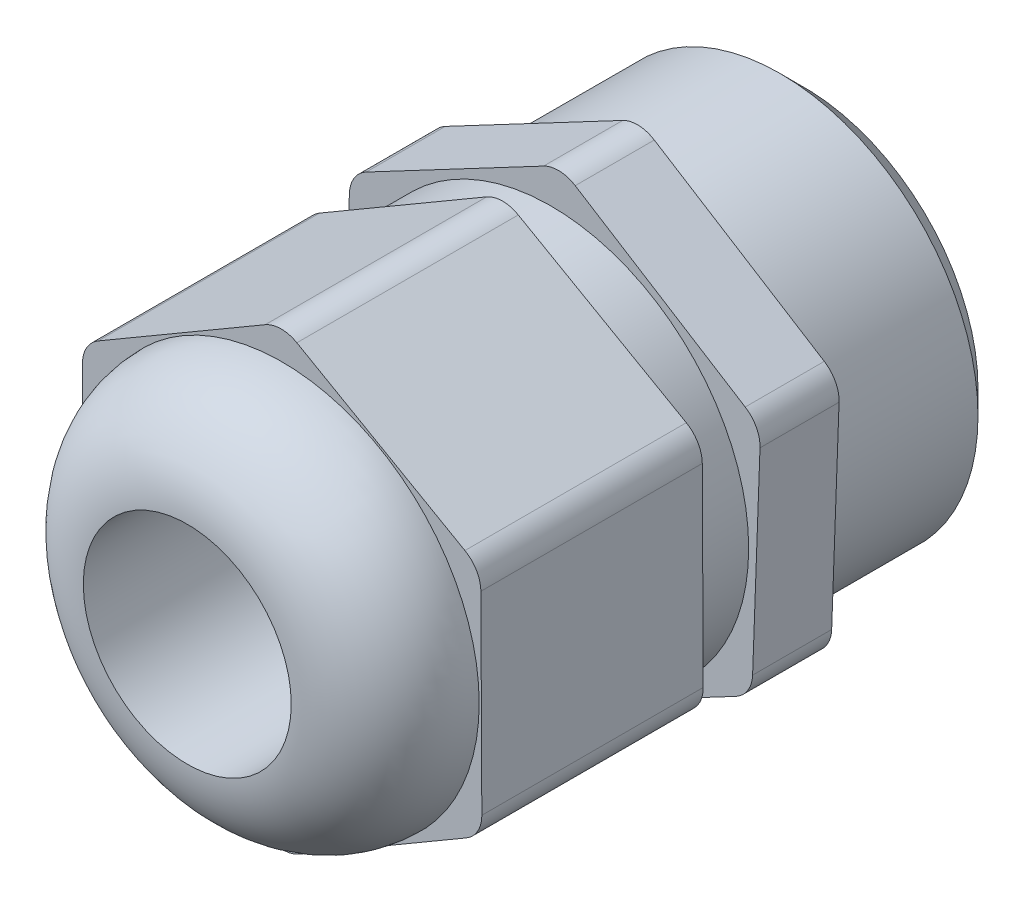
ISO-10303-21;
HEADER;
FILE_DESCRIPTION(('STEP AP214'),'2;1');
FILE_NAME('part.step','',(''),(''),'','','');
FILE_SCHEMA(('AUTOMOTIVE_DESIGN { 1 0 10303 214 1 1 1 1 }'));
ENDSEC;
DATA;
#1=APPLICATION_CONTEXT('core data for automotive mechanical design processes');
#2=APPLICATION_PROTOCOL_DEFINITION('international standard','automotive_design',2000,#1);
#3=PRODUCT_CONTEXT('',#1,'mechanical');
#4=PRODUCT('Part','Part','',(#3));
#5=PRODUCT_RELATED_PRODUCT_CATEGORY('part','',(#4));
#6=PRODUCT_DEFINITION_FORMATION('','',#4);
#7=PRODUCT_DEFINITION_CONTEXT('part definition',#1,'design');
#8=PRODUCT_DEFINITION('design','',#6,#7);
#9=PRODUCT_DEFINITION_SHAPE('','',#8);
#10=(LENGTH_UNIT() NAMED_UNIT(*) SI_UNIT(.MILLI.,.METRE.));
#11=(NAMED_UNIT(*) PLANE_ANGLE_UNIT() SI_UNIT($,.RADIAN.));
#12=(NAMED_UNIT(*) SI_UNIT($,.STERADIAN.) SOLID_ANGLE_UNIT());
#13=UNCERTAINTY_MEASURE_WITH_UNIT(LENGTH_MEASURE(1.E-05),#10,'distance_accuracy_value','');
#14=(GEOMETRIC_REPRESENTATION_CONTEXT(3) GLOBAL_UNCERTAINTY_ASSIGNED_CONTEXT((#13)) GLOBAL_UNIT_ASSIGNED_CONTEXT((#10,
#11,#12)) REPRESENTATION_CONTEXT('',''));
#15=CARTESIAN_POINT('',(0.,0.,0.));
#16=DIRECTION('',(0.,0.,1.));
#17=DIRECTION('',(1.,0.,0.));
#18=AXIS2_PLACEMENT_3D('',#15,#16,#17);
#19=CARTESIAN_POINT('',(12.5593851805348,7.33553925217825,22.));
#20=DIRECTION('',(0.,0.,1.));
#21=DIRECTION('',(1.,0.,0.));
#22=AXIS2_PLACEMENT_3D('',#19,#20,#21);
#23=PLANE('',#22);
#24=DIRECTION('',(0.00502387492270915,-0.999987380260752,0.));
#25=VECTOR('',#24,1.);
#26=CARTESIAN_POINT('',(-12.6324559331117,7.20897699616786,22.));
#27=LINE('',#26,#25);
#28=CARTESIAN_POINT('',(-12.6266548620337,6.05429102980831,22.));
#29=VERTEX_POINT('',#28);
#30=CARTESIAN_POINT('',(-12.5651862516128,-6.1808532858187,22.));
#31=VERTEX_POINT('',#30);
#32=EDGE_CURVE('E763',#29,#31,#27,.T.);
#33=ORIENTED_EDGE('',*,*,#32,.T.);
#34=CARTESIAN_POINT('',(-10.5652114910913,-6.17080553597328,22.));
#35=DIRECTION('',(0.,0.,1.));
#36=DIRECTION('',(1.,0.,0.));
#37=AXIS2_PLACEMENT_3D('',#34,#35,#36);
#38=CIRCLE('',#37,2.);
#39=CARTESIAN_POINT('',(-11.5564972647351,-7.90785836043531,22.));
#40=VERTEX_POINT('',#39);
#41=EDGE_CURVE('E313',#31,#40,#38,.T.);
#42=ORIENTED_EDGE('',*,*,#41,.T.);
#43=DIRECTION('',(0.868526412231015,-0.495642886821874,0.));
#44=VECTOR('',#43,1.);
#45=CARTESIAN_POINT('',(-12.5593851805348,-7.33553925217825,22.));
#46=LINE('',#45,#44);
#47=CARTESIAN_POINT('',(-0.929817163222912,-13.972197140089,22.));
#48=VERTEX_POINT('',#47);
#49=EDGE_CURVE('E221',#40,#48,#46,.T.);
#50=ORIENTED_EDGE('',*,*,#49,.T.);
#51=CARTESIAN_POINT('',(0.0614686104208379,-12.235144315627,22.));
#52=DIRECTION('',(0.,0.,1.));
#53=DIRECTION('',(1.,0.,0.));
#54=AXIS2_PLACEMENT_3D('',#51,#52,#53);
#55=CIRCLE('',#54,2.);
#56=CARTESIAN_POINT('',(1.07015759729859,-13.9621493902436,22.));
#57=VERTEX_POINT('',#56);
#58=EDGE_CURVE('E309',#48,#57,#55,.T.);
#59=ORIENTED_EDGE('',*,*,#58,.T.);
#60=DIRECTION('',(0.863502537308306,0.504344493438878,0.));
#61=VECTOR('',#60,1.);
#62=CARTESIAN_POINT('',(0.0730707525768426,-14.5445162483461,22.));
#63=LINE('',#62,#61);
#64=CARTESIAN_POINT('',(11.6353690883899,-7.79134385427034,22.));
#65=VERTEX_POINT('',#64);
#66=EDGE_CURVE('E246',#57,#65,#63,.T.);
#67=ORIENTED_EDGE('',*,*,#66,.T.);
#68=CARTESIAN_POINT('',(10.6266801015122,-6.06433877965373,22.));
#69=DIRECTION('',(0.,0.,1.));
#70=DIRECTION('',(1.,0.,0.));
#71=AXIS2_PLACEMENT_3D('',#68,#69,#70);
#72=CIRCLE('',#71,2.);
#73=CARTESIAN_POINT('',(12.6266548620337,-6.05429102980831,22.));
#74=VERTEX_POINT('',#73);
#75=EDGE_CURVE('E307',#65,#74,#72,.T.);
#76=ORIENTED_EDGE('',*,*,#75,.T.);
#77=DIRECTION('',(-0.00502387492270915,0.999987380260752,0.));
#78=VECTOR('',#77,1.);
#79=CARTESIAN_POINT('',(12.6324559331117,-7.20897699616786,22.));
#80=LINE('',#79,#78);
#81=CARTESIAN_POINT('',(12.5651862516128,6.1808532858187,22.));
#82=VERTEX_POINT('',#81);
#83=EDGE_CURVE('E233',#74,#82,#80,.T.);
#84=ORIENTED_EDGE('',*,*,#83,.T.);
#85=CARTESIAN_POINT('',(10.5652114910913,6.17080553597329,22.));
#86=DIRECTION('',(0.,0.,1.));
#87=DIRECTION('',(1.,0.,0.));
#88=AXIS2_PLACEMENT_3D('',#85,#86,#87);
#89=CIRCLE('',#88,2.);
#90=CARTESIAN_POINT('',(11.5564972647351,7.90785836043532,22.));
#91=VERTEX_POINT('',#90);
#92=EDGE_CURVE('E303',#82,#91,#89,.T.);
#93=ORIENTED_EDGE('',*,*,#92,.T.);
#94=DIRECTION('',(-0.868526412231015,0.495642886821874,0.));
#95=VECTOR('',#94,1.);
#96=CARTESIAN_POINT('',(12.5593851805348,7.33553925217825,22.));
#97=LINE('',#96,#95);
#98=CARTESIAN_POINT('',(0.929817163222912,13.972197140089,22.));
#99=VERTEX_POINT('',#98);
#100=EDGE_CURVE('E757',#91,#99,#97,.T.);
#101=ORIENTED_EDGE('',*,*,#100,.T.);
#102=CARTESIAN_POINT('',(-0.0614686104208394,12.235144315627,22.));
#103=DIRECTION('',(0.,0.,1.));
#104=DIRECTION('',(1.,0.,0.));
#105=AXIS2_PLACEMENT_3D('',#102,#103,#104);
#106=CIRCLE('',#105,2.);
#107=CARTESIAN_POINT('',(-1.07015759729859,13.9621493902436,22.));
#108=VERTEX_POINT('',#107);
#109=EDGE_CURVE('E305',#99,#108,#106,.T.);
#110=ORIENTED_EDGE('',*,*,#109,.T.);
#111=DIRECTION('',(-0.863502537308306,-0.504344493438877,0.));
#112=VECTOR('',#111,1.);
#113=CARTESIAN_POINT('',(-0.0730707525768443,14.5445162483461,22.));
#114=LINE('',#113,#112);
#115=CARTESIAN_POINT('',(-11.6353690883899,7.79134385427034,22.));
#116=VERTEX_POINT('',#115);
#117=EDGE_CURVE('E760',#108,#116,#114,.T.);
#118=ORIENTED_EDGE('',*,*,#117,.T.);
#119=CARTESIAN_POINT('',(-10.6266801015122,6.06433877965373,22.));
#120=DIRECTION('',(0.,0.,1.));
#121=DIRECTION('',(1.,0.,0.));
#122=AXIS2_PLACEMENT_3D('',#119,#120,#121);
#123=CIRCLE('',#122,2.);
#124=EDGE_CURVE('E311',#116,#29,#123,.T.);
#125=ORIENTED_EDGE('',*,*,#124,.T.);
#126=EDGE_LOOP('',(#33,#42,#50,#59,#67,#76,#84,#93,#101,#110,#118,#125));
#127=FACE_BOUND('',#126,.T.);
#128=CARTESIAN_POINT('',(0.,0.,22.));
#129=DIRECTION('',(0.,0.,1.));
#130=DIRECTION('',(1.,0.,0.));
#131=AXIS2_PLACEMENT_3D('',#128,#129,#130);
#132=CIRCLE('',#131,12.4589940320495);
#133=CARTESIAN_POINT('',(12.4589940320495,0.,22.));
#134=VERTEX_POINT('',#133);
#135=EDGE_CURVE('E747',#134,#134,#132,.T.);
#136=ORIENTED_EDGE('',*,*,#135,.F.);
#137=EDGE_LOOP('',(#136));
#138=FACE_BOUND('',#137,.T.);
#139=ADVANCED_FACE('F38',(#127,#138),#23,.T.);
#140=CARTESIAN_POINT('',(12.7047651645938,-7.97426749692549,5.));
#141=DIRECTION('',(0.,0.,1.));
#142=DIRECTION('',(1.,0.,0.));
#143=AXIS2_PLACEMENT_3D('',#140,#141,#142);
#144=PLANE('',#143);
#145=DIRECTION('',(-0.846984344306256,0.531617833128369,0.));
#146=VECTOR('',#145,1.);
#147=CARTESIAN_POINT('',(13.2583008112069,7.01551563319105,5.));
#148=LINE('',#147,#146);
#149=CARTESIAN_POINT('',(12.2802875328377,7.62937503131639,5.));
#150=VERTEX_POINT('',#149);
#151=CARTESIAN_POINT('',(1.53154892498236,14.3759237319912,5.));
#152=VERTEX_POINT('',#151);
#153=EDGE_CURVE('E254',#150,#152,#148,.T.);
#154=ORIENTED_EDGE('',*,*,#153,.T.);
#155=CARTESIAN_POINT('',(0.468313258725625,12.6819550433787,5.));
#156=DIRECTION('',(0.,0.,1.));
#157=DIRECTION('',(1.,0.,0.));
#158=AXIS2_PLACEMENT_3D('',#155,#156,#157);
#159=CIRCLE('',#158,2.);
#160=CARTESIAN_POINT('',(-0.467088825699853,14.449728484873,5.));
#161=VERTEX_POINT('',#160);
#162=EDGE_CURVE('E366',#152,#161,#159,.T.);
#163=ORIENTED_EDGE('',*,*,#162,.T.);
#164=DIRECTION('',(-0.883886720747132,-0.467701042212739,0.));
#165=VECTOR('',#164,1.);
#166=CARTESIAN_POINT('',(0.553535646613132,14.9897831301165,5.));
#167=LINE('',#166,#165);
#168=CARTESIAN_POINT('',(-11.6841406922808,8.5143221421691,5.));
#169=VERTEX_POINT('',#168);
#170=EDGE_CURVE('E257',#161,#169,#167,.T.);
#171=ORIENTED_EDGE('',*,*,#170,.T.);
#172=CARTESIAN_POINT('',(-10.7487386078553,6.74654870067483,5.));
#173=DIRECTION('',(0.,0.,1.));
#174=DIRECTION('',(1.,0.,0.));
#175=AXIS2_PLACEMENT_3D('',#172,#173,#174);
#176=CIRCLE('',#175,2.);
#177=CARTESIAN_POINT('',(-12.7473763585375,6.82035345355659,5.));
#178=VERTEX_POINT('',#177);
#179=EDGE_CURVE('E358',#169,#178,#176,.T.);
#180=ORIENTED_EDGE('',*,*,#179,.T.);
#181=DIRECTION('',(-0.0369023764408763,-0.999318875341107,0.));
#182=VECTOR('',#181,1.);
#183=CARTESIAN_POINT('',(-12.7047651645938,7.97426749692551,5.));
#184=LINE('',#183,#182);
#185=CARTESIAN_POINT('',(-13.2156896172631,-5.86160158982211,5.));
#186=VERTEX_POINT('',#185);
#187=EDGE_CURVE('E260',#178,#186,#184,.T.);
#188=ORIENTED_EDGE('',*,*,#187,.T.);
#189=CARTESIAN_POINT('',(-11.2170518665809,-5.93540634270386,5.));
#190=DIRECTION('',(0.,0.,1.));
#191=DIRECTION('',(1.,0.,0.));
#192=AXIS2_PLACEMENT_3D('',#189,#190,#191);
#193=CIRCLE('',#192,2.);
#194=CARTESIAN_POINT('',(-12.2802875328377,-7.62937503131637,5.));
#195=VERTEX_POINT('',#194);
#196=EDGE_CURVE('E60',#186,#195,#193,.T.);
#197=ORIENTED_EDGE('',*,*,#196,.T.);
#198=DIRECTION('',(0.846984344306255,-0.531617833128369,0.));
#199=VECTOR('',#198,1.);
#200=CARTESIAN_POINT('',(-13.2583008112069,-7.01551563319104,5.));
#201=LINE('',#200,#199);
#202=CARTESIAN_POINT('',(-1.53154892498237,-14.3759237319912,5.));
#203=VERTEX_POINT('',#202);
#204=EDGE_CURVE('E262',#195,#203,#201,.T.);
#205=ORIENTED_EDGE('',*,*,#204,.T.);
#206=CARTESIAN_POINT('',(-0.468313258725631,-12.6819550433787,5.));
#207=DIRECTION('',(0.,0.,1.));
#208=DIRECTION('',(1.,0.,0.));
#209=AXIS2_PLACEMENT_3D('',#206,#207,#208);
#210=CIRCLE('',#209,2.);
#211=CARTESIAN_POINT('',(0.467088825699846,-14.4497284848729,5.));
#212=VERTEX_POINT('',#211);
#213=EDGE_CURVE('E360',#203,#212,#210,.T.);
#214=ORIENTED_EDGE('',*,*,#213,.T.);
#215=DIRECTION('',(0.883886720747132,0.467701042212738,0.));
#216=VECTOR('',#215,1.);
#217=CARTESIAN_POINT('',(-0.553535646613139,-14.9897831301165,5.));
#218=LINE('',#217,#216);
#219=CARTESIAN_POINT('',(11.6841406922808,-8.51432214216908,5.));
#220=VERTEX_POINT('',#219);
#221=EDGE_CURVE('E247',#212,#220,#218,.T.);
#222=ORIENTED_EDGE('',*,*,#221,.T.);
#223=CARTESIAN_POINT('',(10.7487386078553,-6.74654870067481,5.));
#224=DIRECTION('',(0.,0.,1.));
#225=DIRECTION('',(1.,0.,0.));
#226=AXIS2_PLACEMENT_3D('',#223,#224,#225);
#227=CIRCLE('',#226,2.);
#228=CARTESIAN_POINT('',(12.7473763585375,-6.82035345355656,5.));
#229=VERTEX_POINT('',#228);
#230=EDGE_CURVE('E362',#220,#229,#227,.T.);
#231=ORIENTED_EDGE('',*,*,#230,.T.);
#232=DIRECTION('',(0.0369023764408759,0.999318875341108,0.));
#233=VECTOR('',#232,1.);
#234=CARTESIAN_POINT('',(12.7047651645938,-7.97426749692549,5.));
#235=LINE('',#234,#233);
#236=CARTESIAN_POINT('',(13.2156896172632,5.86160158982213,5.));
#237=VERTEX_POINT('',#236);
#238=EDGE_CURVE('E250',#229,#237,#235,.T.);
#239=ORIENTED_EDGE('',*,*,#238,.T.);
#240=CARTESIAN_POINT('',(11.2170518665809,5.93540634270388,5.));
#241=DIRECTION('',(0.,0.,1.));
#242=DIRECTION('',(1.,0.,0.));
#243=AXIS2_PLACEMENT_3D('',#240,#241,#242);
#244=CIRCLE('',#243,2.);
#245=EDGE_CURVE('E364',#237,#150,#244,.T.);
#246=ORIENTED_EDGE('',*,*,#245,.T.);
#247=EDGE_LOOP('',(#154,#163,#171,#180,#188,#197,#205,#214,#222,#231,#239,#246));
#248=FACE_BOUND('',#247,.T.);
#249=CARTESIAN_POINT('',(0.,0.,5.));
#250=DIRECTION('',(0.,0.,1.));
#251=DIRECTION('',(1.,0.,0.));
#252=AXIS2_PLACEMENT_3D('',#249,#250,#251);
#253=CIRCLE('',#252,12.5);
#254=CARTESIAN_POINT('',(12.5,0.,5.));
#255=VERTEX_POINT('',#254);
#256=EDGE_CURVE('E243',#255,#255,#253,.T.);
#257=ORIENTED_EDGE('',*,*,#256,.F.);
#258=EDGE_LOOP('',(#257));
#259=FACE_BOUND('',#258,.T.);
#260=ADVANCED_FACE('F388',(#248,#259),#144,.T.);
#261=CARTESIAN_POINT('',(12.7047651645938,-7.97426749692549,0.));
#262=DIRECTION('',(0.,0.,1.));
#263=DIRECTION('',(1.,0.,0.));
#264=AXIS2_PLACEMENT_3D('',#261,#262,#263);
#265=PLANE('',#264);
#266=DIRECTION('',(-0.883886720747132,-0.467701042212739,0.));
#267=VECTOR('',#266,1.);
#268=CARTESIAN_POINT('',(0.553535646613132,14.9897831301165,0.));
#269=LINE('',#268,#267);
#270=CARTESIAN_POINT('',(-0.467088825699853,14.449728484873,0.));
#271=VERTEX_POINT('',#270);
#272=CARTESIAN_POINT('',(-11.6841406922808,8.5143221421691,0.));
#273=VERTEX_POINT('',#272);
#274=EDGE_CURVE('E273',#271,#273,#269,.T.);
#275=ORIENTED_EDGE('',*,*,#274,.F.);
#276=CARTESIAN_POINT('',(0.468313258725625,12.6819550433787,0.));
#277=DIRECTION('',(0.,0.,1.));
#278=DIRECTION('',(1.,0.,0.));
#279=AXIS2_PLACEMENT_3D('',#276,#277,#278);
#280=CIRCLE('',#279,2.);
#281=CARTESIAN_POINT('',(1.53154892498236,14.3759237319912,0.));
#282=VERTEX_POINT('',#281);
#283=EDGE_CURVE('E350',#271,#282,#280,.F.);
#284=ORIENTED_EDGE('',*,*,#283,.T.);
#285=DIRECTION('',(-0.846984344306256,0.531617833128369,0.));
#286=VECTOR('',#285,1.);
#287=CARTESIAN_POINT('',(13.2583008112069,7.01551563319105,0.));
#288=LINE('',#287,#286);
#289=CARTESIAN_POINT('',(12.2802875328377,7.62937503131639,0.));
#290=VERTEX_POINT('',#289);
#291=EDGE_CURVE('E270',#290,#282,#288,.T.);
#292=ORIENTED_EDGE('',*,*,#291,.F.);
#293=CARTESIAN_POINT('',(11.2170518665809,5.93540634270388,0.));
#294=DIRECTION('',(0.,0.,1.));
#295=DIRECTION('',(1.,0.,0.));
#296=AXIS2_PLACEMENT_3D('',#293,#294,#295);
#297=CIRCLE('',#296,2.);
#298=CARTESIAN_POINT('',(13.2156896172632,5.86160158982213,0.));
#299=VERTEX_POINT('',#298);
#300=EDGE_CURVE('E348',#290,#299,#297,.F.);
#301=ORIENTED_EDGE('',*,*,#300,.T.);
#302=DIRECTION('',(0.0369023764408759,0.999318875341108,0.));
#303=VECTOR('',#302,1.);
#304=CARTESIAN_POINT('',(12.7047651645938,-7.97426749692549,0.));
#305=LINE('',#304,#303);
#306=CARTESIAN_POINT('',(12.7473763585375,-6.82035345355656,0.));
#307=VERTEX_POINT('',#306);
#308=EDGE_CURVE('E267',#307,#299,#305,.T.);
#309=ORIENTED_EDGE('',*,*,#308,.F.);
#310=CARTESIAN_POINT('',(10.7487386078553,-6.74654870067481,0.));
#311=DIRECTION('',(0.,0.,1.));
#312=DIRECTION('',(1.,0.,0.));
#313=AXIS2_PLACEMENT_3D('',#310,#311,#312);
#314=CIRCLE('',#313,2.);
#315=CARTESIAN_POINT('',(11.6841406922808,-8.51432214216908,0.));
#316=VERTEX_POINT('',#315);
#317=EDGE_CURVE('E346',#307,#316,#314,.F.);
#318=ORIENTED_EDGE('',*,*,#317,.T.);
#319=DIRECTION('',(0.883886720747132,0.467701042212738,0.));
#320=VECTOR('',#319,1.);
#321=CARTESIAN_POINT('',(-0.553535646613139,-14.9897831301165,0.));
#322=LINE('',#321,#320);
#323=CARTESIAN_POINT('',(0.467088825699846,-14.4497284848729,0.));
#324=VERTEX_POINT('',#323);
#325=EDGE_CURVE('E242',#324,#316,#322,.T.);
#326=ORIENTED_EDGE('',*,*,#325,.F.);
#327=CARTESIAN_POINT('',(-0.468313258725631,-12.6819550433787,0.));
#328=DIRECTION('',(0.,0.,1.));
#329=DIRECTION('',(1.,0.,0.));
#330=AXIS2_PLACEMENT_3D('',#327,#328,#329);
#331=CIRCLE('',#330,2.);
#332=CARTESIAN_POINT('',(-1.53154892498237,-14.3759237319912,0.));
#333=VERTEX_POINT('',#332);
#334=EDGE_CURVE('E344',#324,#333,#331,.F.);
#335=ORIENTED_EDGE('',*,*,#334,.T.);
#336=DIRECTION('',(0.846984344306255,-0.531617833128369,0.));
#337=VECTOR('',#336,1.);
#338=CARTESIAN_POINT('',(-13.2583008112069,-7.01551563319104,0.));
#339=LINE('',#338,#337);
#340=CARTESIAN_POINT('',(-12.2802875328377,-7.62937503131637,0.));
#341=VERTEX_POINT('',#340);
#342=EDGE_CURVE('E251',#341,#333,#339,.T.);
#343=ORIENTED_EDGE('',*,*,#342,.F.);
#344=CARTESIAN_POINT('',(-11.2170518665809,-5.93540634270386,0.));
#345=DIRECTION('',(0.,0.,1.));
#346=DIRECTION('',(1.,0.,0.));
#347=AXIS2_PLACEMENT_3D('',#344,#345,#346);
#348=CIRCLE('',#347,2.);
#349=CARTESIAN_POINT('',(-13.2156896172631,-5.86160158982211,0.));
#350=VERTEX_POINT('',#349);
#351=EDGE_CURVE('E340',#341,#350,#348,.F.);
#352=ORIENTED_EDGE('',*,*,#351,.T.);
#353=DIRECTION('',(-0.0369023764408763,-0.999318875341107,0.));
#354=VECTOR('',#353,1.);
#355=CARTESIAN_POINT('',(-12.7047651645938,7.97426749692551,0.));
#356=LINE('',#355,#354);
#357=CARTESIAN_POINT('',(-12.7473763585375,6.82035345355659,0.));
#358=VERTEX_POINT('',#357);
#359=EDGE_CURVE('E276',#358,#350,#356,.T.);
#360=ORIENTED_EDGE('',*,*,#359,.F.);
#361=CARTESIAN_POINT('',(-10.7487386078553,6.74654870067483,0.));
#362=DIRECTION('',(0.,0.,1.));
#363=DIRECTION('',(1.,0.,0.));
#364=AXIS2_PLACEMENT_3D('',#361,#362,#363);
#365=CIRCLE('',#364,2.);
#366=EDGE_CURVE('E342',#358,#273,#365,.F.);
#367=ORIENTED_EDGE('',*,*,#366,.T.);
#368=EDGE_LOOP('',(#275,#284,#292,#301,#309,#318,#326,#335,#343,#352,#360,#367));
#369=FACE_BOUND('',#368,.T.);
#370=CARTESIAN_POINT('',(0.,0.,0.));
#371=DIRECTION('',(0.,0.,1.));
#372=DIRECTION('',(1.,0.,0.));
#373=AXIS2_PLACEMENT_3D('',#370,#371,#372);
#374=CIRCLE('',#373,12.5);
#375=CARTESIAN_POINT('',(12.5,0.,0.));
#376=VERTEX_POINT('',#375);
#377=EDGE_CURVE('E264',#376,#376,#374,.F.);
#378=ORIENTED_EDGE('',*,*,#377,.F.);
#379=EDGE_LOOP('',(#378));
#380=FACE_BOUND('',#379,.T.);
#381=ADVANCED_FACE('F396',(#369,#380),#265,.F.);
#382=CARTESIAN_POINT('',(-0.553535646613139,-14.9897831301165,5.));
#383=DIRECTION('',(-0.467701042212738,0.883886720747132,0.));
#384=DIRECTION('',(-0.883886720747132,-0.467701042212738,0.));
#385=AXIS2_PLACEMENT_3D('',#382,#383,#384);
#386=PLANE('',#385);
#387=ORIENTED_EDGE('',*,*,#325,.T.);
#388=DIRECTION('',(0.,0.,-1.));
#389=VECTOR('',#388,1.);
#390=CARTESIAN_POINT('',(11.6841406922808,-8.51432214216908,5.));
#391=LINE('',#390,#389);
#392=EDGE_CURVE('E376',#316,#220,#391,.F.);
#393=ORIENTED_EDGE('',*,*,#392,.T.);
#394=ORIENTED_EDGE('',*,*,#221,.F.);
#395=DIRECTION('',(0.,0.,-1.));
#396=VECTOR('',#395,1.);
#397=CARTESIAN_POINT('',(0.467088825699846,-14.4497284848729,5.));
#398=LINE('',#397,#396);
#399=EDGE_CURVE('E373',#212,#324,#398,.T.);
#400=ORIENTED_EDGE('',*,*,#399,.T.);
#401=EDGE_LOOP('',(#387,#393,#394,#400));
#402=FACE_BOUND('',#401,.T.);
#403=ADVANCED_FACE('F405',(#402),#386,.F.);
#404=CARTESIAN_POINT('',(12.7047651645938,-7.97426749692549,5.));
#405=DIRECTION('',(-0.999318875341108,0.0369023764408759,0.));
#406=DIRECTION('',(-0.0369023764408759,-0.999318875341108,0.));
#407=AXIS2_PLACEMENT_3D('',#404,#405,#406);
#408=PLANE('',#407);
#409=ORIENTED_EDGE('',*,*,#308,.T.);
#410=DIRECTION('',(0.,0.,-1.));
#411=VECTOR('',#410,1.);
#412=CARTESIAN_POINT('',(13.2156896172632,5.86160158982213,5.));
#413=LINE('',#412,#411);
#414=EDGE_CURVE('E371',#299,#237,#413,.F.);
#415=ORIENTED_EDGE('',*,*,#414,.T.);
#416=ORIENTED_EDGE('',*,*,#238,.F.);
#417=DIRECTION('',(0.,0.,-1.));
#418=VECTOR('',#417,1.);
#419=CARTESIAN_POINT('',(12.7473763585375,-6.82035345355656,5.));
#420=LINE('',#419,#418);
#421=EDGE_CURVE('E368',#229,#307,#420,.T.);
#422=ORIENTED_EDGE('',*,*,#421,.T.);
#423=EDGE_LOOP('',(#409,#415,#416,#422));
#424=FACE_BOUND('',#423,.T.);
#425=ADVANCED_FACE('F414',(#424),#408,.F.);
#426=CARTESIAN_POINT('',(13.2583008112069,7.01551563319105,5.));
#427=DIRECTION('',(-0.531617833128369,-0.846984344306256,0.));
#428=DIRECTION('',(0.846984344306256,-0.531617833128369,0.));
#429=AXIS2_PLACEMENT_3D('',#426,#427,#428);
#430=PLANE('',#429);
#431=ORIENTED_EDGE('',*,*,#291,.T.);
#432=DIRECTION('',(0.,0.,-1.));
#433=VECTOR('',#432,1.);
#434=CARTESIAN_POINT('',(1.53154892498236,14.3759237319912,5.));
#435=LINE('',#434,#433);
#436=EDGE_CURVE('E355',#282,#152,#435,.F.);
#437=ORIENTED_EDGE('',*,*,#436,.T.);
#438=ORIENTED_EDGE('',*,*,#153,.F.);
#439=DIRECTION('',(0.,0.,-1.));
#440=VECTOR('',#439,1.);
#441=CARTESIAN_POINT('',(12.2802875328377,7.62937503131639,5.));
#442=LINE('',#441,#440);
#443=EDGE_CURVE('E352',#150,#290,#442,.T.);
#444=ORIENTED_EDGE('',*,*,#443,.T.);
#445=EDGE_LOOP('',(#431,#437,#438,#444));
#446=FACE_BOUND('',#445,.T.);
#447=ADVANCED_FACE('F423',(#446),#430,.F.);
#448=CARTESIAN_POINT('',(0.553535646613132,14.9897831301165,5.));
#449=DIRECTION('',(0.467701042212739,-0.883886720747132,0.));
#450=DIRECTION('',(0.883886720747132,0.467701042212739,0.));
#451=AXIS2_PLACEMENT_3D('',#448,#449,#450);
#452=PLANE('',#451);
#453=ORIENTED_EDGE('',*,*,#170,.F.);
#454=DIRECTION('',(0.,0.,-1.));
#455=VECTOR('',#454,1.);
#456=CARTESIAN_POINT('',(-0.467088825699853,14.449728484873,5.));
#457=LINE('',#456,#455);
#458=EDGE_CURVE('E337',#161,#271,#457,.T.);
#459=ORIENTED_EDGE('',*,*,#458,.T.);
#460=ORIENTED_EDGE('',*,*,#274,.T.);
#461=DIRECTION('',(0.,0.,-1.));
#462=VECTOR('',#461,1.);
#463=CARTESIAN_POINT('',(-11.6841406922808,8.51432214216909,5.));
#464=LINE('',#463,#462);
#465=EDGE_CURVE('E335',#273,#169,#464,.F.);
#466=ORIENTED_EDGE('',*,*,#465,.T.);
#467=EDGE_LOOP('',(#453,#459,#460,#466));
#468=FACE_BOUND('',#467,.T.);
#469=ADVANCED_FACE('F431',(#468),#452,.F.);
#470=CARTESIAN_POINT('',(-12.7047651645938,7.97426749692551,5.));
#471=DIRECTION('',(0.999318875341108,-0.0369023764408763,0.));
#472=DIRECTION('',(0.0369023764408763,0.999318875341108,0.));
#473=AXIS2_PLACEMENT_3D('',#470,#471,#472);
#474=PLANE('',#473);
#475=ORIENTED_EDGE('',*,*,#187,.F.);
#476=DIRECTION('',(0.,0.,-1.));
#477=VECTOR('',#476,1.);
#478=CARTESIAN_POINT('',(-12.7473763585375,6.82035345355659,5.));
#479=LINE('',#478,#477);
#480=EDGE_CURVE('E11',#178,#358,#479,.T.);
#481=ORIENTED_EDGE('',*,*,#480,.T.);
#482=ORIENTED_EDGE('',*,*,#359,.T.);
#483=DIRECTION('',(0.,0.,-1.));
#484=VECTOR('',#483,1.);
#485=CARTESIAN_POINT('',(-13.2156896172631,-5.86160158982211,5.));
#486=LINE('',#485,#484);
#487=EDGE_CURVE('E46',#350,#186,#486,.F.);
#488=ORIENTED_EDGE('',*,*,#487,.T.);
#489=EDGE_LOOP('',(#475,#481,#482,#488));
#490=FACE_BOUND('',#489,.T.);
#491=ADVANCED_FACE('F384',(#490),#474,.F.);
#492=CARTESIAN_POINT('',(-13.2583008112069,-7.01551563319104,5.));
#493=DIRECTION('',(0.531617833128369,0.846984344306255,0.));
#494=DIRECTION('',(-0.846984344306255,0.531617833128369,0.));
#495=AXIS2_PLACEMENT_3D('',#492,#493,#494);
#496=PLANE('',#495);
#497=ORIENTED_EDGE('',*,*,#342,.T.);
#498=DIRECTION('',(0.,0.,-1.));
#499=VECTOR('',#498,1.);
#500=CARTESIAN_POINT('',(-1.53154892498237,-14.3759237319912,5.));
#501=LINE('',#500,#499);
#502=EDGE_CURVE('E53',#333,#203,#501,.F.);
#503=ORIENTED_EDGE('',*,*,#502,.T.);
#504=ORIENTED_EDGE('',*,*,#204,.F.);
#505=DIRECTION('',(0.,0.,-1.));
#506=VECTOR('',#505,1.);
#507=CARTESIAN_POINT('',(-12.2802875328377,-7.62937503131638,5.));
#508=LINE('',#507,#506);
#509=EDGE_CURVE('E378',#195,#341,#508,.T.);
#510=ORIENTED_EDGE('',*,*,#509,.T.);
#511=EDGE_LOOP('',(#497,#503,#504,#510));
#512=FACE_BOUND('',#511,.T.);
#513=ADVANCED_FACE('F393',(#512),#496,.F.);
#514=CARTESIAN_POINT('',(0.,0.,-11.));
#515=DIRECTION('',(0.,0.,1.));
#516=DIRECTION('',(1.,0.,0.));
#517=AXIS2_PLACEMENT_3D('',#514,#515,#516);
#518=CYLINDRICAL_SURFACE('',#517,12.5);
#519=CARTESIAN_POINT('',(0.,0.,-9.49999999999999));
#520=DIRECTION('',(0.,0.,-1.));
#521=DIRECTION('',(-1.,0.,0.));
#522=AXIS2_PLACEMENT_3D('',#519,#520,#521);
#523=CIRCLE('',#522,12.5);
#524=CARTESIAN_POINT('',(-12.5,0.,-9.49999999999999));
#525=VERTEX_POINT('',#524);
#526=EDGE_CURVE('E285',#525,#525,#523,.F.);
#527=ORIENTED_EDGE('',*,*,#526,.T.);
#528=EDGE_LOOP('',(#527));
#529=FACE_BOUND('',#528,.T.);
#530=ORIENTED_EDGE('',*,*,#377,.T.);
#531=EDGE_LOOP('',(#530));
#532=FACE_BOUND('',#531,.T.);
#533=ADVANCED_FACE('F486',(#529,#532),#518,.T.);
#534=CARTESIAN_POINT('',(0.,0.,-11.));
#535=DIRECTION('',(0.,0.,-1.));
#536=DIRECTION('',(-1.,0.,0.));
#537=AXIS2_PLACEMENT_3D('',#534,#535,#536);
#538=PLANE('',#537);
#539=CARTESIAN_POINT('',(0.,0.,-11.));
#540=DIRECTION('',(0.,0.,-1.));
#541=DIRECTION('',(-1.,0.,0.));
#542=AXIS2_PLACEMENT_3D('',#539,#540,#541);
#543=CIRCLE('',#542,6.57418375359953);
#544=CARTESIAN_POINT('',(-6.57418375359953,0.,-11.));
#545=VERTEX_POINT('',#544);
#546=EDGE_CURVE('E291',#545,#545,#543,.T.);
#547=ORIENTED_EDGE('',*,*,#546,.F.);
#548=EDGE_LOOP('',(#547));
#549=FACE_BOUND('',#548,.T.);
#550=CARTESIAN_POINT('',(0.,0.,-11.));
#551=DIRECTION('',(0.,0.,-1.));
#552=DIRECTION('',(-1.,0.,0.));
#553=AXIS2_PLACEMENT_3D('',#550,#551,#552);
#554=CIRCLE('',#553,11.);
#555=CARTESIAN_POINT('',(-11.,0.,-11.));
#556=VERTEX_POINT('',#555);
#557=EDGE_CURVE('E282',#556,#556,#554,.T.);
#558=ORIENTED_EDGE('',*,*,#557,.T.);
#559=EDGE_LOOP('',(#558));
#560=FACE_BOUND('',#559,.T.);
#561=ADVANCED_FACE('F483',(#549,#560),#538,.T.);
#562=CARTESIAN_POINT('',(0.,0.,-11.));
#563=DIRECTION('',(0.,0.,1.));
#564=DIRECTION('',(1.,0.,0.));
#565=AXIS2_PLACEMENT_3D('',#562,#563,#564);
#566=CONICAL_SURFACE('',#565,11.,0.785398163397446);
#567=ORIENTED_EDGE('',*,*,#526,.F.);
#568=EDGE_LOOP('',(#567));
#569=FACE_BOUND('',#568,.T.);
#570=ORIENTED_EDGE('',*,*,#557,.F.);
#571=EDGE_LOOP('',(#570));
#572=FACE_BOUND('',#571,.T.);
#573=ADVANCED_FACE('F481',(#569,#572),#566,.T.);
#574=CARTESIAN_POINT('',(0.,0.,8.));
#575=DIRECTION('',(0.,0.,-1.));
#576=DIRECTION('',(-1.,0.,0.));
#577=AXIS2_PLACEMENT_3D('',#574,#575,#576);
#578=CYLINDRICAL_SURFACE('',#577,12.5);
#579=CARTESIAN_POINT('',(0.,0.,8.));
#580=DIRECTION('',(0.,0.,1.));
#581=DIRECTION('',(1.,0.,0.));
#582=AXIS2_PLACEMENT_3D('',#579,#580,#581);
#583=CIRCLE('',#582,12.5);
#584=CARTESIAN_POINT('',(12.5,0.,8.));
#585=VERTEX_POINT('',#584);
#586=EDGE_CURVE('E239',#585,#585,#583,.T.);
#587=ORIENTED_EDGE('',*,*,#586,.F.);
#588=EDGE_LOOP('',(#587));
#589=FACE_BOUND('',#588,.T.);
#590=ORIENTED_EDGE('',*,*,#256,.T.);
#591=EDGE_LOOP('',(#590));
#592=FACE_BOUND('',#591,.T.);
#593=ADVANCED_FACE('F456',(#589,#592),#578,.T.);
#594=CARTESIAN_POINT('',(12.5593851805348,7.33553925217825,8.));
#595=DIRECTION('',(0.,0.,1.));
#596=DIRECTION('',(1.,0.,0.));
#597=AXIS2_PLACEMENT_3D('',#594,#595,#596);
#598=PLANE('',#597);
#599=DIRECTION('',(0.868526412231015,-0.495642886821874,0.));
#600=VECTOR('',#599,1.);
#601=CARTESIAN_POINT('',(-12.5593851805348,-7.33553925217825,8.));
#602=LINE('',#601,#600);
#603=CARTESIAN_POINT('',(-11.5564972647351,-7.90785836043531,8.));
#604=VERTEX_POINT('',#603);
#605=CARTESIAN_POINT('',(-0.929817163222912,-13.972197140089,8.));
#606=VERTEX_POINT('',#605);
#607=EDGE_CURVE('E218',#604,#606,#602,.T.);
#608=ORIENTED_EDGE('',*,*,#607,.F.);
#609=CARTESIAN_POINT('',(-10.5652114910913,-6.17080553597328,8.));
#610=DIRECTION('',(0.,0.,1.));
#611=DIRECTION('',(1.,0.,0.));
#612=AXIS2_PLACEMENT_3D('',#609,#610,#611);
#613=CIRCLE('',#612,2.);
#614=CARTESIAN_POINT('',(-12.5651862516128,-6.1808532858187,8.));
#615=VERTEX_POINT('',#614);
#616=EDGE_CURVE('E201',#604,#615,#613,.F.);
#617=ORIENTED_EDGE('',*,*,#616,.T.);
#618=DIRECTION('',(0.00502387492270915,-0.999987380260752,0.));
#619=VECTOR('',#618,1.);
#620=CARTESIAN_POINT('',(-12.6324559331117,7.20897699616786,8.));
#621=LINE('',#620,#619);
#622=CARTESIAN_POINT('',(-12.6266548620337,6.05429102980831,8.));
#623=VERTEX_POINT('',#622);
#624=EDGE_CURVE('E230',#623,#615,#621,.T.);
#625=ORIENTED_EDGE('',*,*,#624,.F.);
#626=CARTESIAN_POINT('',(-10.6266801015122,6.06433877965373,8.));
#627=DIRECTION('',(0.,0.,1.));
#628=DIRECTION('',(1.,0.,0.));
#629=AXIS2_PLACEMENT_3D('',#626,#627,#628);
#630=CIRCLE('',#629,2.);
#631=CARTESIAN_POINT('',(-11.6353690883899,7.79134385427034,8.));
#632=VERTEX_POINT('',#631);
#633=EDGE_CURVE('E212',#623,#632,#630,.F.);
#634=ORIENTED_EDGE('',*,*,#633,.T.);
#635=DIRECTION('',(-0.863502537308306,-0.504344493438877,0.));
#636=VECTOR('',#635,1.);
#637=CARTESIAN_POINT('',(-0.0730707525768443,14.5445162483461,8.));
#638=LINE('',#637,#636);
#639=CARTESIAN_POINT('',(-1.07015759729859,13.9621493902436,8.));
#640=VERTEX_POINT('',#639);
#641=EDGE_CURVE('E235',#640,#632,#638,.T.);
#642=ORIENTED_EDGE('',*,*,#641,.F.);
#643=CARTESIAN_POINT('',(-0.0614686104208394,12.235144315627,8.));
#644=DIRECTION('',(0.,0.,1.));
#645=DIRECTION('',(1.,0.,0.));
#646=AXIS2_PLACEMENT_3D('',#643,#644,#645);
#647=CIRCLE('',#646,2.);
#648=CARTESIAN_POINT('',(0.929817163222912,13.972197140089,8.));
#649=VERTEX_POINT('',#648);
#650=EDGE_CURVE('E294',#640,#649,#647,.F.);
#651=ORIENTED_EDGE('',*,*,#650,.T.);
#652=DIRECTION('',(-0.868526412231015,0.495642886821874,0.));
#653=VECTOR('',#652,1.);
#654=CARTESIAN_POINT('',(12.5593851805348,7.33553925217825,8.));
#655=LINE('',#654,#653);
#656=CARTESIAN_POINT('',(11.5564972647351,7.90785836043532,8.));
#657=VERTEX_POINT('',#656);
#658=EDGE_CURVE('E751',#657,#649,#655,.T.);
#659=ORIENTED_EDGE('',*,*,#658,.F.);
#660=CARTESIAN_POINT('',(10.5652114910913,6.17080553597329,8.));
#661=DIRECTION('',(0.,0.,1.));
#662=DIRECTION('',(1.,0.,0.));
#663=AXIS2_PLACEMENT_3D('',#660,#661,#662);
#664=CIRCLE('',#663,2.);
#665=CARTESIAN_POINT('',(12.5651862516128,6.1808532858187,8.));
#666=VERTEX_POINT('',#665);
#667=EDGE_CURVE('E222',#657,#666,#664,.F.);
#668=ORIENTED_EDGE('',*,*,#667,.T.);
#669=DIRECTION('',(-0.00502387492270915,0.999987380260752,0.));
#670=VECTOR('',#669,1.);
#671=CARTESIAN_POINT('',(12.6324559331117,-7.20897699616786,8.));
#672=LINE('',#671,#670);
#673=CARTESIAN_POINT('',(12.6266548620337,-6.05429102980831,8.));
#674=VERTEX_POINT('',#673);
#675=EDGE_CURVE('E748',#674,#666,#672,.T.);
#676=ORIENTED_EDGE('',*,*,#675,.F.);
#677=CARTESIAN_POINT('',(10.6266801015122,-6.06433877965373,8.));
#678=DIRECTION('',(0.,0.,1.));
#679=DIRECTION('',(1.,0.,0.));
#680=AXIS2_PLACEMENT_3D('',#677,#678,#679);
#681=CIRCLE('',#680,2.);
#682=CARTESIAN_POINT('',(11.6353690883899,-7.79134385427034,8.));
#683=VERTEX_POINT('',#682);
#684=EDGE_CURVE('E296',#674,#683,#681,.F.);
#685=ORIENTED_EDGE('',*,*,#684,.T.);
#686=DIRECTION('',(0.863502537308306,0.504344493438878,0.));
#687=VECTOR('',#686,1.);
#688=CARTESIAN_POINT('',(0.0730707525768426,-14.5445162483461,8.));
#689=LINE('',#688,#687);
#690=CARTESIAN_POINT('',(1.07015759729859,-13.9621493902436,8.));
#691=VERTEX_POINT('',#690);
#692=EDGE_CURVE('E229',#691,#683,#689,.T.);
#693=ORIENTED_EDGE('',*,*,#692,.F.);
#694=CARTESIAN_POINT('',(0.0614686104208379,-12.235144315627,8.));
#695=DIRECTION('',(0.,0.,1.));
#696=DIRECTION('',(1.,0.,0.));
#697=AXIS2_PLACEMENT_3D('',#694,#695,#696);
#698=CIRCLE('',#697,2.);
#699=EDGE_CURVE('E228',#691,#606,#698,.F.);
#700=ORIENTED_EDGE('',*,*,#699,.T.);
#701=EDGE_LOOP('',(#608,#617,#625,#634,#642,#651,#659,#668,#676,#685,#693,#700));
#702=FACE_BOUND('',#701,.T.);
#703=ORIENTED_EDGE('',*,*,#586,.T.);
#704=EDGE_LOOP('',(#703));
#705=FACE_BOUND('',#704,.T.);
#706=ADVANCED_FACE('F225',(#702,#705),#598,.F.);
#707=CARTESIAN_POINT('',(12.6324559331117,-7.20897699616786,22.));
#708=DIRECTION('',(-0.999987380260752,-0.00502387492270916,0.));
#709=DIRECTION('',(0.00502387492270916,-0.999987380260752,0.));
#710=AXIS2_PLACEMENT_3D('',#707,#708,#709);
#711=PLANE('',#710);
#712=ORIENTED_EDGE('',*,*,#83,.F.);
#713=DIRECTION('',(0.,0.,-1.));
#714=VECTOR('',#713,1.);
#715=CARTESIAN_POINT('',(12.6266548620337,-6.05429102980831,22.));
#716=LINE('',#715,#714);
#717=EDGE_CURVE('E327',#74,#674,#716,.T.);
#718=ORIENTED_EDGE('',*,*,#717,.T.);
#719=ORIENTED_EDGE('',*,*,#675,.T.);
#720=DIRECTION('',(0.,0.,-1.));
#721=VECTOR('',#720,1.);
#722=CARTESIAN_POINT('',(12.5651862516128,6.1808532858187,22.));
#723=LINE('',#722,#721);
#724=EDGE_CURVE('E325',#666,#82,#723,.F.);
#725=ORIENTED_EDGE('',*,*,#724,.T.);
#726=EDGE_LOOP('',(#712,#718,#719,#725));
#727=FACE_BOUND('',#726,.T.);
#728=ADVANCED_FACE('F455',(#727),#711,.F.);
#729=CARTESIAN_POINT('',(12.5593851805348,7.33553925217825,22.));
#730=DIRECTION('',(-0.495642886821874,-0.868526412231015,0.));
#731=DIRECTION('',(0.868526412231015,-0.495642886821874,0.));
#732=AXIS2_PLACEMENT_3D('',#729,#730,#731);
#733=PLANE('',#732);
#734=ORIENTED_EDGE('',*,*,#658,.T.);
#735=DIRECTION('',(0.,0.,-1.));
#736=VECTOR('',#735,1.);
#737=CARTESIAN_POINT('',(0.92981716322291,13.972197140089,22.));
#738=LINE('',#737,#736);
#739=EDGE_CURVE('E333',#649,#99,#738,.F.);
#740=ORIENTED_EDGE('',*,*,#739,.T.);
#741=ORIENTED_EDGE('',*,*,#100,.F.);
#742=DIRECTION('',(0.,0.,-1.));
#743=VECTOR('',#742,1.);
#744=CARTESIAN_POINT('',(11.5564972647351,7.90785836043532,22.));
#745=LINE('',#744,#743);
#746=EDGE_CURVE('E330',#91,#657,#745,.T.);
#747=ORIENTED_EDGE('',*,*,#746,.T.);
#748=EDGE_LOOP('',(#734,#740,#741,#747));
#749=FACE_BOUND('',#748,.T.);
#750=ADVANCED_FACE('F471',(#749),#733,.F.);
#751=CARTESIAN_POINT('',(-0.0730707525768443,14.5445162483461,22.));
#752=DIRECTION('',(0.504344493438877,-0.863502537308306,0.));
#753=DIRECTION('',(0.863502537308306,0.504344493438877,0.));
#754=AXIS2_PLACEMENT_3D('',#751,#752,#753);
#755=PLANE('',#754);
#756=ORIENTED_EDGE('',*,*,#641,.T.);
#757=DIRECTION('',(0.,0.,-1.));
#758=VECTOR('',#757,1.);
#759=CARTESIAN_POINT('',(-11.6353690883899,7.79134385427034,22.));
#760=LINE('',#759,#758);
#761=EDGE_CURVE('E318',#632,#116,#760,.F.);
#762=ORIENTED_EDGE('',*,*,#761,.T.);
#763=ORIENTED_EDGE('',*,*,#117,.F.);
#764=DIRECTION('',(0.,0.,-1.));
#765=VECTOR('',#764,1.);
#766=CARTESIAN_POINT('',(-1.07015759729859,13.9621493902436,22.));
#767=LINE('',#766,#765);
#768=EDGE_CURVE('E315',#108,#640,#767,.T.);
#769=ORIENTED_EDGE('',*,*,#768,.T.);
#770=EDGE_LOOP('',(#756,#762,#763,#769));
#771=FACE_BOUND('',#770,.T.);
#772=ADVANCED_FACE('F467',(#771),#755,.F.);
#773=CARTESIAN_POINT('',(-12.6324559331117,7.20897699616786,22.));
#774=DIRECTION('',(0.999987380260752,0.00502387492270916,0.));
#775=DIRECTION('',(-0.00502387492270916,0.999987380260752,0.));
#776=AXIS2_PLACEMENT_3D('',#773,#774,#775);
#777=PLANE('',#776);
#778=ORIENTED_EDGE('',*,*,#624,.T.);
#779=DIRECTION('',(0.,0.,-1.));
#780=VECTOR('',#779,1.);
#781=CARTESIAN_POINT('',(-12.5651862516128,-6.1808532858187,22.));
#782=LINE('',#781,#780);
#783=EDGE_CURVE('E206',#615,#31,#782,.F.);
#784=ORIENTED_EDGE('',*,*,#783,.T.);
#785=ORIENTED_EDGE('',*,*,#32,.F.);
#786=DIRECTION('',(0.,0.,-1.));
#787=VECTOR('',#786,1.);
#788=CARTESIAN_POINT('',(-12.6266548620337,6.05429102980831,22.));
#789=LINE('',#788,#787);
#790=EDGE_CURVE('E211',#29,#623,#789,.T.);
#791=ORIENTED_EDGE('',*,*,#790,.T.);
#792=EDGE_LOOP('',(#778,#784,#785,#791));
#793=FACE_BOUND('',#792,.T.);
#794=ADVANCED_FACE('F464',(#793),#777,.F.);
#795=CARTESIAN_POINT('',(-12.5593851805348,-7.33553925217825,22.));
#796=DIRECTION('',(0.495642886821874,0.868526412231015,0.));
#797=DIRECTION('',(-0.868526412231015,0.495642886821874,0.));
#798=AXIS2_PLACEMENT_3D('',#795,#796,#797);
#799=PLANE('',#798);
#800=ORIENTED_EDGE('',*,*,#49,.F.);
#801=DIRECTION('',(0.,0.,-1.));
#802=VECTOR('',#801,1.);
#803=CARTESIAN_POINT('',(-11.5564972647351,-7.90785836043531,22.));
#804=LINE('',#803,#802);
#805=EDGE_CURVE('E205',#40,#604,#804,.T.);
#806=ORIENTED_EDGE('',*,*,#805,.T.);
#807=ORIENTED_EDGE('',*,*,#607,.T.);
#808=DIRECTION('',(0.,0.,-1.));
#809=VECTOR('',#808,1.);
#810=CARTESIAN_POINT('',(-0.929817163222912,-13.972197140089,22.));
#811=LINE('',#810,#809);
#812=EDGE_CURVE('E223',#606,#48,#811,.F.);
#813=ORIENTED_EDGE('',*,*,#812,.T.);
#814=EDGE_LOOP('',(#800,#806,#807,#813));
#815=FACE_BOUND('',#814,.T.);
#816=ADVANCED_FACE('F217',(#815),#799,.F.);
#817=CARTESIAN_POINT('',(0.0730707525768426,-14.5445162483461,22.));
#818=DIRECTION('',(-0.504344493438878,0.863502537308306,0.));
#819=DIRECTION('',(-0.863502537308306,-0.504344493438878,0.));
#820=AXIS2_PLACEMENT_3D('',#817,#818,#819);
#821=PLANE('',#820);
#822=ORIENTED_EDGE('',*,*,#66,.F.);
#823=DIRECTION('',(0.,0.,-1.));
#824=VECTOR('',#823,1.);
#825=CARTESIAN_POINT('',(1.07015759729859,-13.9621493902436,22.));
#826=LINE('',#825,#824);
#827=EDGE_CURVE('E322',#57,#691,#826,.T.);
#828=ORIENTED_EDGE('',*,*,#827,.T.);
#829=ORIENTED_EDGE('',*,*,#692,.T.);
#830=DIRECTION('',(0.,0.,-1.));
#831=VECTOR('',#830,1.);
#832=CARTESIAN_POINT('',(11.6353690883899,-7.79134385427034,22.));
#833=LINE('',#832,#831);
#834=EDGE_CURVE('E320',#683,#65,#833,.F.);
#835=ORIENTED_EDGE('',*,*,#834,.T.);
#836=EDGE_LOOP('',(#822,#828,#829,#835));
#837=FACE_BOUND('',#836,.T.);
#838=ADVANCED_FACE('F457',(#837),#821,.F.);
#839=CARTESIAN_POINT('',(0.,0.,22.));
#840=DIRECTION('',(0.,0.,1.));
#841=DIRECTION('',(1.,0.,0.));
#842=AXIS2_PLACEMENT_3D('',#839,#840,#841);
#843=TOROIDAL_SURFACE('',#842,6.45899403204955,6.);
#844=CARTESIAN_POINT('',(0.,0.,27.9988941754334));
#845=DIRECTION('',(0.,0.,-1.));
#846=DIRECTION('',(-1.,0.,0.));
#847=AXIS2_PLACEMENT_3D('',#844,#845,#846);
#848=CIRCLE('',#847,6.57418375359953);
#849=CARTESIAN_POINT('',(-6.57418375359953,0.,27.9988941754334));
#850=VERTEX_POINT('',#849);
#851=EDGE_CURVE('E288',#850,#850,#848,.F.);
#852=ORIENTED_EDGE('',*,*,#851,.F.);
#853=EDGE_LOOP('',(#852));
#854=FACE_BOUND('',#853,.T.);
#855=ORIENTED_EDGE('',*,*,#135,.T.);
#856=EDGE_LOOP('',(#855));
#857=FACE_BOUND('',#856,.T.);
#858=ADVANCED_FACE('F460',(#854,#857),#843,.T.);
#859=CARTESIAN_POINT('',(0.,0.,-14.));
#860=DIRECTION('',(0.,0.,1.));
#861=DIRECTION('',(1.,0.,0.));
#862=AXIS2_PLACEMENT_3D('',#859,#860,#861);
#863=CYLINDRICAL_SURFACE('',#862,6.57418375359953);
#864=ORIENTED_EDGE('',*,*,#546,.T.);
#865=EDGE_LOOP('',(#864));
#866=FACE_BOUND('',#865,.T.);
#867=ORIENTED_EDGE('',*,*,#851,.T.);
#868=EDGE_LOOP('',(#867));
#869=FACE_BOUND('',#868,.T.);
#870=ADVANCED_FACE('F452',(#866,#869),#863,.F.);
#871=CARTESIAN_POINT('',(-10.5652114910913,-6.17080553597328,22.));
#872=DIRECTION('',(0.,0.,-1.));
#873=DIRECTION('',(-1.,0.,0.));
#874=AXIS2_PLACEMENT_3D('',#871,#872,#873);
#875=CYLINDRICAL_SURFACE('',#874,2.);
#876=ORIENTED_EDGE('',*,*,#41,.F.);
#877=ORIENTED_EDGE('',*,*,#783,.F.);
#878=ORIENTED_EDGE('',*,*,#616,.F.);
#879=ORIENTED_EDGE('',*,*,#805,.F.);
#880=EDGE_LOOP('',(#876,#877,#878,#879));
#881=FACE_BOUND('',#880,.T.);
#882=ADVANCED_FACE('F204',(#881),#875,.T.);
#883=CARTESIAN_POINT('',(-10.6266801015122,6.06433877965373,22.));
#884=DIRECTION('',(0.,0.,-1.));
#885=DIRECTION('',(-1.,0.,0.));
#886=AXIS2_PLACEMENT_3D('',#883,#884,#885);
#887=CYLINDRICAL_SURFACE('',#886,2.);
#888=ORIENTED_EDGE('',*,*,#124,.F.);
#889=ORIENTED_EDGE('',*,*,#761,.F.);
#890=ORIENTED_EDGE('',*,*,#633,.F.);
#891=ORIENTED_EDGE('',*,*,#790,.F.);
#892=EDGE_LOOP('',(#888,#889,#890,#891));
#893=FACE_BOUND('',#892,.T.);
#894=ADVANCED_FACE('F513',(#893),#887,.T.);
#895=CARTESIAN_POINT('',(0.0614686104208379,-12.235144315627,22.));
#896=DIRECTION('',(0.,0.,-1.));
#897=DIRECTION('',(-1.,0.,0.));
#898=AXIS2_PLACEMENT_3D('',#895,#896,#897);
#899=CYLINDRICAL_SURFACE('',#898,2.);
#900=ORIENTED_EDGE('',*,*,#58,.F.);
#901=ORIENTED_EDGE('',*,*,#812,.F.);
#902=ORIENTED_EDGE('',*,*,#699,.F.);
#903=ORIENTED_EDGE('',*,*,#827,.F.);
#904=EDGE_LOOP('',(#900,#901,#902,#903));
#905=FACE_BOUND('',#904,.T.);
#906=ADVANCED_FACE('F516',(#905),#899,.T.);
#907=CARTESIAN_POINT('',(10.6266801015122,-6.06433877965373,22.));
#908=DIRECTION('',(0.,0.,-1.));
#909=DIRECTION('',(-1.,0.,0.));
#910=AXIS2_PLACEMENT_3D('',#907,#908,#909);
#911=CYLINDRICAL_SURFACE('',#910,2.);
#912=ORIENTED_EDGE('',*,*,#75,.F.);
#913=ORIENTED_EDGE('',*,*,#834,.F.);
#914=ORIENTED_EDGE('',*,*,#684,.F.);
#915=ORIENTED_EDGE('',*,*,#717,.F.);
#916=EDGE_LOOP('',(#912,#913,#914,#915));
#917=FACE_BOUND('',#916,.T.);
#918=ADVANCED_FACE('F520',(#917),#911,.T.);
#919=CARTESIAN_POINT('',(-0.0614686104208394,12.235144315627,22.));
#920=DIRECTION('',(0.,0.,-1.));
#921=DIRECTION('',(-1.,0.,0.));
#922=AXIS2_PLACEMENT_3D('',#919,#920,#921);
#923=CYLINDRICAL_SURFACE('',#922,2.);
#924=ORIENTED_EDGE('',*,*,#109,.F.);
#925=ORIENTED_EDGE('',*,*,#739,.F.);
#926=ORIENTED_EDGE('',*,*,#650,.F.);
#927=ORIENTED_EDGE('',*,*,#768,.F.);
#928=EDGE_LOOP('',(#924,#925,#926,#927));
#929=FACE_BOUND('',#928,.T.);
#930=ADVANCED_FACE('F524',(#929),#923,.T.);
#931=CARTESIAN_POINT('',(10.5652114910913,6.17080553597329,22.));
#932=DIRECTION('',(0.,0.,-1.));
#933=DIRECTION('',(-1.,0.,0.));
#934=AXIS2_PLACEMENT_3D('',#931,#932,#933);
#935=CYLINDRICAL_SURFACE('',#934,2.);
#936=ORIENTED_EDGE('',*,*,#92,.F.);
#937=ORIENTED_EDGE('',*,*,#724,.F.);
#938=ORIENTED_EDGE('',*,*,#667,.F.);
#939=ORIENTED_EDGE('',*,*,#746,.F.);
#940=EDGE_LOOP('',(#936,#937,#938,#939));
#941=FACE_BOUND('',#940,.T.);
#942=ADVANCED_FACE('F528',(#941),#935,.T.);
#943=CARTESIAN_POINT('',(0.468313258725625,12.6819550433787,5.));
#944=DIRECTION('',(0.,0.,-1.));
#945=DIRECTION('',(-1.,0.,0.));
#946=AXIS2_PLACEMENT_3D('',#943,#944,#945);
#947=CYLINDRICAL_SURFACE('',#946,2.);
#948=ORIENTED_EDGE('',*,*,#162,.F.);
#949=ORIENTED_EDGE('',*,*,#436,.F.);
#950=ORIENTED_EDGE('',*,*,#283,.F.);
#951=ORIENTED_EDGE('',*,*,#458,.F.);
#952=EDGE_LOOP('',(#948,#949,#950,#951));
#953=FACE_BOUND('',#952,.T.);
#954=ADVANCED_FACE('F429',(#953),#947,.T.);
#955=CARTESIAN_POINT('',(11.2170518665809,5.93540634270388,5.));
#956=DIRECTION('',(0.,0.,-1.));
#957=DIRECTION('',(-1.,0.,0.));
#958=AXIS2_PLACEMENT_3D('',#955,#956,#957);
#959=CYLINDRICAL_SURFACE('',#958,2.);
#960=ORIENTED_EDGE('',*,*,#245,.F.);
#961=ORIENTED_EDGE('',*,*,#414,.F.);
#962=ORIENTED_EDGE('',*,*,#300,.F.);
#963=ORIENTED_EDGE('',*,*,#443,.F.);
#964=EDGE_LOOP('',(#960,#961,#962,#963));
#965=FACE_BOUND('',#964,.T.);
#966=ADVANCED_FACE('F420',(#965),#959,.T.);
#967=CARTESIAN_POINT('',(10.7487386078553,-6.74654870067481,5.));
#968=DIRECTION('',(0.,0.,-1.));
#969=DIRECTION('',(-1.,0.,0.));
#970=AXIS2_PLACEMENT_3D('',#967,#968,#969);
#971=CYLINDRICAL_SURFACE('',#970,2.);
#972=ORIENTED_EDGE('',*,*,#230,.F.);
#973=ORIENTED_EDGE('',*,*,#392,.F.);
#974=ORIENTED_EDGE('',*,*,#317,.F.);
#975=ORIENTED_EDGE('',*,*,#421,.F.);
#976=EDGE_LOOP('',(#972,#973,#974,#975));
#977=FACE_BOUND('',#976,.T.);
#978=ADVANCED_FACE('F411',(#977),#971,.T.);
#979=CARTESIAN_POINT('',(-0.468313258725631,-12.6819550433787,5.));
#980=DIRECTION('',(0.,0.,-1.));
#981=DIRECTION('',(-1.,0.,0.));
#982=AXIS2_PLACEMENT_3D('',#979,#980,#981);
#983=CYLINDRICAL_SURFACE('',#982,2.);
#984=ORIENTED_EDGE('',*,*,#213,.F.);
#985=ORIENTED_EDGE('',*,*,#502,.F.);
#986=ORIENTED_EDGE('',*,*,#334,.F.);
#987=ORIENTED_EDGE('',*,*,#399,.F.);
#988=EDGE_LOOP('',(#984,#985,#986,#987));
#989=FACE_BOUND('',#988,.T.);
#990=ADVANCED_FACE('F402',(#989),#983,.T.);
#991=CARTESIAN_POINT('',(-10.7487386078553,6.74654870067483,5.));
#992=DIRECTION('',(0.,0.,-1.));
#993=DIRECTION('',(-1.,0.,0.));
#994=AXIS2_PLACEMENT_3D('',#991,#992,#993);
#995=CYLINDRICAL_SURFACE('',#994,2.);
#996=ORIENTED_EDGE('',*,*,#179,.F.);
#997=ORIENTED_EDGE('',*,*,#465,.F.);
#998=ORIENTED_EDGE('',*,*,#366,.F.);
#999=ORIENTED_EDGE('',*,*,#480,.F.);
#1000=EDGE_LOOP('',(#996,#997,#998,#999));
#1001=FACE_BOUND('',#1000,.T.);
#1002=ADVANCED_FACE('F434',(#1001),#995,.T.);
#1003=CARTESIAN_POINT('',(-11.2170518665809,-5.93540634270386,5.));
#1004=DIRECTION('',(0.,0.,-1.));
#1005=DIRECTION('',(-1.,0.,0.));
#1006=AXIS2_PLACEMENT_3D('',#1003,#1004,#1005);
#1007=CYLINDRICAL_SURFACE('',#1006,2.);
#1008=ORIENTED_EDGE('',*,*,#196,.F.);
#1009=ORIENTED_EDGE('',*,*,#487,.F.);
#1010=ORIENTED_EDGE('',*,*,#351,.F.);
#1011=ORIENTED_EDGE('',*,*,#509,.F.);
#1012=EDGE_LOOP('',(#1008,#1009,#1010,#1011));
#1013=FACE_BOUND('',#1012,.T.);
#1014=ADVANCED_FACE('F40',(#1013),#1007,.T.);
#1015=CLOSED_SHELL('',(#139,#260,#381,#403,#425,#447,#469,#491,#513,#533,#561,#573,#593,#706,
#728,#750,#772,#794,#816,#838,#858,#870,#882,#894,#906,#918,#930,#942,#954,#966,#978,#990,#1002,#1014));
#1016=MANIFOLD_SOLID_BREP('B2',#1015);
#1017=ADVANCED_BREP_SHAPE_REPRESENTATION('',(#18,#1016),#14);
#1018=SHAPE_DEFINITION_REPRESENTATION(#9,#1017);
ENDSEC;
END-ISO-10303-21;
